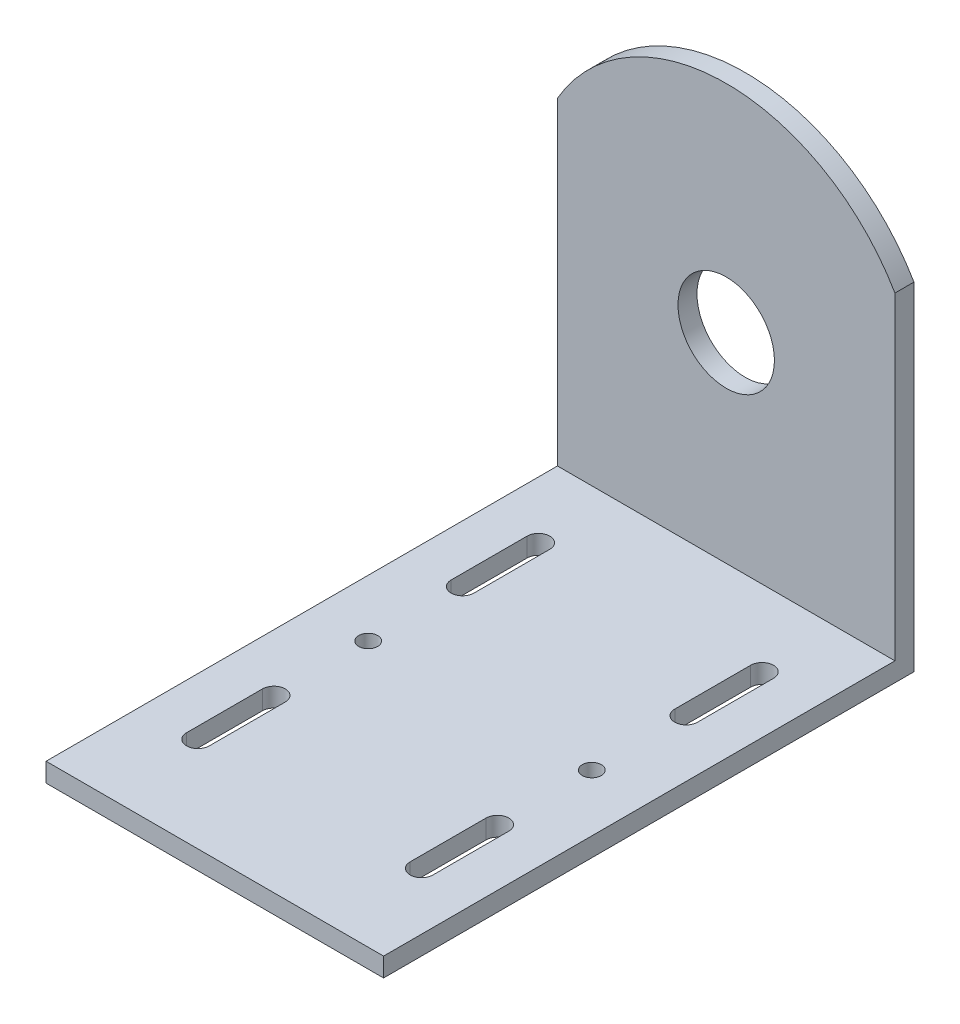
ISO-10303-21;
HEADER;
FILE_DESCRIPTION(('STEP AP214'),'2;1');
FILE_NAME('part.step','',(''),(''),'','','');
FILE_SCHEMA(('AUTOMOTIVE_DESIGN { 1 0 10303 214 1 1 1 1 }'));
ENDSEC;
DATA;
#1=APPLICATION_CONTEXT('core data for automotive mechanical design processes');
#2=APPLICATION_PROTOCOL_DEFINITION('international standard','automotive_design',2000,#1);
#3=PRODUCT_CONTEXT('',#1,'mechanical');
#4=PRODUCT('Part','Part','',(#3));
#5=PRODUCT_RELATED_PRODUCT_CATEGORY('part','',(#4));
#6=PRODUCT_DEFINITION_FORMATION('','',#4);
#7=PRODUCT_DEFINITION_CONTEXT('part definition',#1,'design');
#8=PRODUCT_DEFINITION('design','',#6,#7);
#9=PRODUCT_DEFINITION_SHAPE('','',#8);
#10=(LENGTH_UNIT() NAMED_UNIT(*) SI_UNIT(.MILLI.,.METRE.));
#11=(NAMED_UNIT(*) PLANE_ANGLE_UNIT() SI_UNIT($,.RADIAN.));
#12=(NAMED_UNIT(*) SI_UNIT($,.STERADIAN.) SOLID_ANGLE_UNIT());
#13=UNCERTAINTY_MEASURE_WITH_UNIT(LENGTH_MEASURE(1.E-05),#10,'distance_accuracy_value','');
#14=(GEOMETRIC_REPRESENTATION_CONTEXT(3) GLOBAL_UNCERTAINTY_ASSIGNED_CONTEXT((#13)) GLOBAL_UNIT_ASSIGNED_CONTEXT((#10,
#11,#12)) REPRESENTATION_CONTEXT('',''));
#15=CARTESIAN_POINT('',(0.,0.,0.));
#16=DIRECTION('',(0.,0.,1.));
#17=DIRECTION('',(1.,0.,0.));
#18=AXIS2_PLACEMENT_3D('',#15,#16,#17);
#19=CARTESIAN_POINT('',(0.,10.,0.));
#20=DIRECTION('',(0.,1.,0.));
#21=DIRECTION('',(0.,0.,1.));
#22=AXIS2_PLACEMENT_3D('',#19,#20,#21);
#23=PLANE('',#22);
#24=CARTESIAN_POINT('',(58.9,10.,139.7));
#25=DIRECTION('',(0.,-1.,0.));
#26=DIRECTION('',(0.,0.,-1.));
#27=AXIS2_PLACEMENT_3D('',#24,#25,#26);
#28=CIRCLE('',#27,5.);
#29=CARTESIAN_POINT('',(58.9,10.,134.7));
#30=VERTEX_POINT('',#29);
#31=EDGE_CURVE('E252',#30,#30,#28,.T.);
#32=ORIENTED_EDGE('',*,*,#31,.T.);
#33=EDGE_LOOP('',(#32));
#34=FACE_BOUND('',#33,.T.);
#35=CARTESIAN_POINT('',(-58.9,10.,189.4));
#36=DIRECTION('',(0.,1.,0.));
#37=DIRECTION('',(0.,0.,-1.));
#38=AXIS2_PLACEMENT_3D('',#35,#36,#37);
#39=CIRCLE('',#38,6.00000000000001);
#40=CARTESIAN_POINT('',(-52.9,10.,189.4));
#41=VERTEX_POINT('',#40);
#42=CARTESIAN_POINT('',(-64.9,10.,189.4));
#43=VERTEX_POINT('',#42);
#44=EDGE_CURVE('E87',#41,#43,#39,.T.);
#45=ORIENTED_EDGE('',*,*,#44,.F.);
#46=DIRECTION('',(0.,0.,-1.));
#47=VECTOR('',#46,1.);
#48=CARTESIAN_POINT('',(-52.9,10.,189.4));
#49=LINE('',#48,#47);
#50=CARTESIAN_POINT('',(-52.9,10.,229.4));
#51=VERTEX_POINT('',#50);
#52=EDGE_CURVE('E303',#51,#41,#49,.T.);
#53=ORIENTED_EDGE('',*,*,#52,.F.);
#54=CARTESIAN_POINT('',(-58.9,10.,229.4));
#55=DIRECTION('',(0.,1.,0.));
#56=DIRECTION('',(0.,0.,-1.));
#57=AXIS2_PLACEMENT_3D('',#54,#55,#56);
#58=CIRCLE('',#57,6.00000000000001);
#59=CARTESIAN_POINT('',(-64.9,10.,229.4));
#60=VERTEX_POINT('',#59);
#61=EDGE_CURVE('E317',#60,#51,#58,.T.);
#62=ORIENTED_EDGE('',*,*,#61,.F.);
#63=DIRECTION('',(0.,0.,1.));
#64=VECTOR('',#63,1.);
#65=CARTESIAN_POINT('',(-64.9,10.,189.4));
#66=LINE('',#65,#64);
#67=EDGE_CURVE('E314',#43,#60,#66,.T.);
#68=ORIENTED_EDGE('',*,*,#67,.F.);
#69=EDGE_LOOP('',(#45,#53,#62,#68));
#70=FACE_BOUND('',#69,.T.);
#71=CARTESIAN_POINT('',(58.9,10.,189.4));
#72=DIRECTION('',(0.,1.,0.));
#73=DIRECTION('',(0.,0.,1.));
#74=AXIS2_PLACEMENT_3D('',#71,#72,#73);
#75=CIRCLE('',#74,6.00000000000001);
#76=CARTESIAN_POINT('',(64.9,10.,189.4));
#77=VERTEX_POINT('',#76);
#78=CARTESIAN_POINT('',(52.9,10.,189.4));
#79=VERTEX_POINT('',#78);
#80=EDGE_CURVE('E95',#77,#79,#75,.T.);
#81=ORIENTED_EDGE('',*,*,#80,.F.);
#82=DIRECTION('',(0.,0.,-1.));
#83=VECTOR('',#82,1.);
#84=CARTESIAN_POINT('',(64.9,10.,189.4));
#85=LINE('',#84,#83);
#86=CARTESIAN_POINT('',(64.9,10.,229.4));
#87=VERTEX_POINT('',#86);
#88=EDGE_CURVE('E273',#87,#77,#85,.T.);
#89=ORIENTED_EDGE('',*,*,#88,.F.);
#90=CARTESIAN_POINT('',(58.9,10.,229.4));
#91=DIRECTION('',(0.,1.,0.));
#92=DIRECTION('',(0.,0.,1.));
#93=AXIS2_PLACEMENT_3D('',#90,#91,#92);
#94=CIRCLE('',#93,6.00000000000001);
#95=CARTESIAN_POINT('',(52.9,10.,229.4));
#96=VERTEX_POINT('',#95);
#97=EDGE_CURVE('E288',#96,#87,#94,.T.);
#98=ORIENTED_EDGE('',*,*,#97,.F.);
#99=DIRECTION('',(0.,0.,1.));
#100=VECTOR('',#99,1.);
#101=CARTESIAN_POINT('',(52.9,10.,189.4));
#102=LINE('',#101,#100);
#103=EDGE_CURVE('E284',#79,#96,#102,.T.);
#104=ORIENTED_EDGE('',*,*,#103,.F.);
#105=EDGE_LOOP('',(#81,#89,#98,#104));
#106=FACE_BOUND('',#105,.T.);
#107=CARTESIAN_POINT('',(58.9,10.,90.));
#108=DIRECTION('',(0.,1.,0.));
#109=DIRECTION('',(0.,0.,-1.));
#110=AXIS2_PLACEMENT_3D('',#107,#108,#109);
#111=CIRCLE('',#110,6.00000000000001);
#112=CARTESIAN_POINT('',(52.9,10.,90.));
#113=VERTEX_POINT('',#112);
#114=CARTESIAN_POINT('',(64.9,10.,90.));
#115=VERTEX_POINT('',#114);
#116=EDGE_CURVE('E228',#113,#115,#111,.T.);
#117=ORIENTED_EDGE('',*,*,#116,.F.);
#118=DIRECTION('',(0.,0.,1.));
#119=VECTOR('',#118,1.);
#120=CARTESIAN_POINT('',(52.9,10.,90.));
#121=LINE('',#120,#119);
#122=CARTESIAN_POINT('',(52.9,10.,50.));
#123=VERTEX_POINT('',#122);
#124=EDGE_CURVE('E246',#123,#113,#121,.T.);
#125=ORIENTED_EDGE('',*,*,#124,.F.);
#126=CARTESIAN_POINT('',(58.9,10.,50.));
#127=DIRECTION('',(0.,1.,0.));
#128=DIRECTION('',(0.,0.,-1.));
#129=AXIS2_PLACEMENT_3D('',#126,#127,#128);
#130=CIRCLE('',#129,6.00000000000001);
#131=CARTESIAN_POINT('',(64.9,10.,50.));
#132=VERTEX_POINT('',#131);
#133=EDGE_CURVE('E249',#132,#123,#130,.T.);
#134=ORIENTED_EDGE('',*,*,#133,.F.);
#135=DIRECTION('',(0.,0.,-1.));
#136=VECTOR('',#135,1.);
#137=CARTESIAN_POINT('',(64.9,10.,90.));
#138=LINE('',#137,#136);
#139=EDGE_CURVE('E258',#115,#132,#138,.T.);
#140=ORIENTED_EDGE('',*,*,#139,.F.);
#141=EDGE_LOOP('',(#117,#125,#134,#140));
#142=FACE_BOUND('',#141,.T.);
#143=CARTESIAN_POINT('',(-58.9,10.,90.));
#144=DIRECTION('',(0.,1.,0.));
#145=DIRECTION('',(0.,0.,1.));
#146=AXIS2_PLACEMENT_3D('',#143,#144,#145);
#147=CIRCLE('',#146,6.00000000000001);
#148=CARTESIAN_POINT('',(-64.9,10.,90.));
#149=VERTEX_POINT('',#148);
#150=CARTESIAN_POINT('',(-52.9,10.,90.));
#151=VERTEX_POINT('',#150);
#152=EDGE_CURVE('E265',#149,#151,#147,.T.);
#153=ORIENTED_EDGE('',*,*,#152,.F.);
#154=DIRECTION('',(0.,0.,1.));
#155=VECTOR('',#154,1.);
#156=CARTESIAN_POINT('',(-64.9,10.,90.));
#157=LINE('',#156,#155);
#158=CARTESIAN_POINT('',(-64.9,10.,50.));
#159=VERTEX_POINT('',#158);
#160=EDGE_CURVE('E332',#159,#149,#157,.T.);
#161=ORIENTED_EDGE('',*,*,#160,.F.);
#162=CARTESIAN_POINT('',(-58.9,10.,50.));
#163=DIRECTION('',(0.,1.,0.));
#164=DIRECTION('',(0.,0.,1.));
#165=AXIS2_PLACEMENT_3D('',#162,#163,#164);
#166=CIRCLE('',#165,6.00000000000001);
#167=CARTESIAN_POINT('',(-52.9,10.,50.));
#168=VERTEX_POINT('',#167);
#169=EDGE_CURVE('E346',#168,#159,#166,.T.);
#170=ORIENTED_EDGE('',*,*,#169,.F.);
#171=DIRECTION('',(0.,0.,-1.));
#172=VECTOR('',#171,1.);
#173=CARTESIAN_POINT('',(-52.9,10.,90.));
#174=LINE('',#173,#172);
#175=EDGE_CURVE('E343',#151,#168,#174,.T.);
#176=ORIENTED_EDGE('',*,*,#175,.F.);
#177=EDGE_LOOP('',(#153,#161,#170,#176));
#178=FACE_BOUND('',#177,.T.);
#179=DIRECTION('',(1.,0.,0.));
#180=VECTOR('',#179,1.);
#181=CARTESIAN_POINT('',(0.,10.,10.));
#182=LINE('',#181,#180);
#183=CARTESIAN_POINT('',(-88.9,10.,10.));
#184=VERTEX_POINT('',#183);
#185=CARTESIAN_POINT('',(88.9,10.,10.));
#186=VERTEX_POINT('',#185);
#187=EDGE_CURVE('E378',#184,#186,#182,.T.);
#188=ORIENTED_EDGE('',*,*,#187,.F.);
#189=DIRECTION('',(0.,0.,-1.));
#190=VECTOR('',#189,1.);
#191=CARTESIAN_POINT('',(-88.9,10.,0.));
#192=LINE('',#191,#190);
#193=CARTESIAN_POINT('',(-88.9,10.,279.4));
#194=VERTEX_POINT('',#193);
#195=EDGE_CURVE('E380',#194,#184,#192,.T.);
#196=ORIENTED_EDGE('',*,*,#195,.F.);
#197=DIRECTION('',(-1.,0.,0.));
#198=VECTOR('',#197,1.);
#199=CARTESIAN_POINT('',(-88.9,10.,279.4));
#200=LINE('',#199,#198);
#201=CARTESIAN_POINT('',(88.9,10.,279.4));
#202=VERTEX_POINT('',#201);
#203=EDGE_CURVE('E383',#202,#194,#200,.T.);
#204=ORIENTED_EDGE('',*,*,#203,.F.);
#205=DIRECTION('',(0.,0.,1.));
#206=VECTOR('',#205,1.);
#207=CARTESIAN_POINT('',(88.9,10.,0.));
#208=LINE('',#207,#206);
#209=EDGE_CURVE('E395',#186,#202,#208,.T.);
#210=ORIENTED_EDGE('',*,*,#209,.F.);
#211=EDGE_LOOP('',(#188,#196,#204,#210));
#212=FACE_BOUND('',#211,.T.);
#213=CARTESIAN_POINT('',(-58.9,10.,139.7));
#214=DIRECTION('',(0.,1.,0.));
#215=DIRECTION('',(0.,0.,1.));
#216=AXIS2_PLACEMENT_3D('',#213,#214,#215);
#217=CIRCLE('',#216,5.);
#218=CARTESIAN_POINT('',(-58.9,10.,144.7));
#219=VERTEX_POINT('',#218);
#220=EDGE_CURVE('E418',#219,#219,#217,.T.);
#221=ORIENTED_EDGE('',*,*,#220,.F.);
#222=EDGE_LOOP('',(#221));
#223=FACE_BOUND('',#222,.T.);
#224=ADVANCED_FACE('F71',(#34,#70,#106,#142,#178,#212,#223),#23,.T.);
#225=CARTESIAN_POINT('',(0.,0.,0.));
#226=DIRECTION('',(0.,1.,0.));
#227=DIRECTION('',(0.,0.,1.));
#228=AXIS2_PLACEMENT_3D('',#225,#226,#227);
#229=PLANE('',#228);
#230=DIRECTION('',(0.,0.,-1.));
#231=VECTOR('',#230,1.);
#232=CARTESIAN_POINT('',(-88.9,0.,0.));
#233=LINE('',#232,#231);
#234=CARTESIAN_POINT('',(-88.9,0.,279.4));
#235=VERTEX_POINT('',#234);
#236=CARTESIAN_POINT('',(-88.9,0.,0.));
#237=VERTEX_POINT('',#236);
#238=EDGE_CURVE('E384',#235,#237,#233,.T.);
#239=ORIENTED_EDGE('',*,*,#238,.T.);
#240=DIRECTION('',(1.,0.,0.));
#241=VECTOR('',#240,1.);
#242=CARTESIAN_POINT('',(-88.9,0.,0.));
#243=LINE('',#242,#241);
#244=CARTESIAN_POINT('',(88.9,0.,0.));
#245=VERTEX_POINT('',#244);
#246=EDGE_CURVE('E12',#237,#245,#243,.T.);
#247=ORIENTED_EDGE('',*,*,#246,.T.);
#248=DIRECTION('',(0.,0.,1.));
#249=VECTOR('',#248,1.);
#250=CARTESIAN_POINT('',(88.9,0.,0.));
#251=LINE('',#250,#249);
#252=CARTESIAN_POINT('',(88.9,0.,279.4));
#253=VERTEX_POINT('',#252);
#254=EDGE_CURVE('E79',#245,#253,#251,.T.);
#255=ORIENTED_EDGE('',*,*,#254,.T.);
#256=DIRECTION('',(-1.,0.,0.));
#257=VECTOR('',#256,1.);
#258=CARTESIAN_POINT('',(-88.9,0.,279.4));
#259=LINE('',#258,#257);
#260=EDGE_CURVE('E412',#253,#235,#259,.T.);
#261=ORIENTED_EDGE('',*,*,#260,.T.);
#262=EDGE_LOOP('',(#239,#247,#255,#261));
#263=FACE_BOUND('',#262,.T.);
#264=DIRECTION('',(0.,0.,1.));
#265=VECTOR('',#264,1.);
#266=CARTESIAN_POINT('',(-64.9,0.,90.));
#267=LINE('',#266,#265);
#268=CARTESIAN_POINT('',(-64.9,0.,50.));
#269=VERTEX_POINT('',#268);
#270=CARTESIAN_POINT('',(-64.9,0.,90.));
#271=VERTEX_POINT('',#270);
#272=EDGE_CURVE('E338',#269,#271,#267,.T.);
#273=ORIENTED_EDGE('',*,*,#272,.T.);
#274=CARTESIAN_POINT('',(-58.9,0.,90.));
#275=DIRECTION('',(0.,1.,0.));
#276=DIRECTION('',(0.,0.,1.));
#277=AXIS2_PLACEMENT_3D('',#274,#275,#276);
#278=CIRCLE('',#277,6.00000000000001);
#279=CARTESIAN_POINT('',(-52.9,0.,90.));
#280=VERTEX_POINT('',#279);
#281=EDGE_CURVE('E328',#271,#280,#278,.T.);
#282=ORIENTED_EDGE('',*,*,#281,.T.);
#283=DIRECTION('',(0.,0.,-1.));
#284=VECTOR('',#283,1.);
#285=CARTESIAN_POINT('',(-52.9,0.,90.));
#286=LINE('',#285,#284);
#287=CARTESIAN_POINT('',(-52.9,0.,50.));
#288=VERTEX_POINT('',#287);
#289=EDGE_CURVE('E331',#280,#288,#286,.T.);
#290=ORIENTED_EDGE('',*,*,#289,.T.);
#291=CARTESIAN_POINT('',(-58.9,0.,50.));
#292=DIRECTION('',(0.,1.,0.));
#293=DIRECTION('',(0.,0.,1.));
#294=AXIS2_PLACEMENT_3D('',#291,#292,#293);
#295=CIRCLE('',#294,6.00000000000001);
#296=EDGE_CURVE('E335',#288,#269,#295,.T.);
#297=ORIENTED_EDGE('',*,*,#296,.T.);
#298=EDGE_LOOP('',(#273,#282,#290,#297));
#299=FACE_BOUND('',#298,.T.);
#300=DIRECTION('',(0.,0.,1.));
#301=VECTOR('',#300,1.);
#302=CARTESIAN_POINT('',(52.9,0.,90.));
#303=LINE('',#302,#301);
#304=CARTESIAN_POINT('',(52.9,0.,50.));
#305=VERTEX_POINT('',#304);
#306=CARTESIAN_POINT('',(52.9,0.,90.));
#307=VERTEX_POINT('',#306);
#308=EDGE_CURVE('E233',#305,#307,#303,.T.);
#309=ORIENTED_EDGE('',*,*,#308,.T.);
#310=CARTESIAN_POINT('',(58.9,0.,90.));
#311=DIRECTION('',(0.,1.,0.));
#312=DIRECTION('',(0.,0.,-1.));
#313=AXIS2_PLACEMENT_3D('',#310,#311,#312);
#314=CIRCLE('',#313,6.00000000000001);
#315=CARTESIAN_POINT('',(64.9,0.,90.));
#316=VERTEX_POINT('',#315);
#317=EDGE_CURVE('E225',#307,#316,#314,.T.);
#318=ORIENTED_EDGE('',*,*,#317,.T.);
#319=DIRECTION('',(0.,0.,-1.));
#320=VECTOR('',#319,1.);
#321=CARTESIAN_POINT('',(64.9,0.,90.));
#322=LINE('',#321,#320);
#323=CARTESIAN_POINT('',(64.9,0.,50.));
#324=VERTEX_POINT('',#323);
#325=EDGE_CURVE('E237',#316,#324,#322,.T.);
#326=ORIENTED_EDGE('',*,*,#325,.T.);
#327=CARTESIAN_POINT('',(58.9,0.,50.));
#328=DIRECTION('',(0.,1.,0.));
#329=DIRECTION('',(0.,0.,-1.));
#330=AXIS2_PLACEMENT_3D('',#327,#328,#329);
#331=CIRCLE('',#330,6.00000000000001);
#332=EDGE_CURVE('E241',#324,#305,#331,.T.);
#333=ORIENTED_EDGE('',*,*,#332,.T.);
#334=EDGE_LOOP('',(#309,#318,#326,#333));
#335=FACE_BOUND('',#334,.T.);
#336=DIRECTION('',(0.,0.,-1.));
#337=VECTOR('',#336,1.);
#338=CARTESIAN_POINT('',(64.9,0.,189.4));
#339=LINE('',#338,#337);
#340=CARTESIAN_POINT('',(64.9,0.,229.4));
#341=VERTEX_POINT('',#340);
#342=CARTESIAN_POINT('',(64.9,0.,189.4));
#343=VERTEX_POINT('',#342);
#344=EDGE_CURVE('E279',#341,#343,#339,.T.);
#345=ORIENTED_EDGE('',*,*,#344,.T.);
#346=CARTESIAN_POINT('',(58.9,0.,189.4));
#347=DIRECTION('',(0.,1.,0.));
#348=DIRECTION('',(0.,0.,1.));
#349=AXIS2_PLACEMENT_3D('',#346,#347,#348);
#350=CIRCLE('',#349,6.00000000000001);
#351=CARTESIAN_POINT('',(52.9,0.,189.4));
#352=VERTEX_POINT('',#351);
#353=EDGE_CURVE('E269',#343,#352,#350,.T.);
#354=ORIENTED_EDGE('',*,*,#353,.T.);
#355=DIRECTION('',(0.,0.,1.));
#356=VECTOR('',#355,1.);
#357=CARTESIAN_POINT('',(52.9,0.,189.4));
#358=LINE('',#357,#356);
#359=CARTESIAN_POINT('',(52.9,0.,229.4));
#360=VERTEX_POINT('',#359);
#361=EDGE_CURVE('E272',#352,#360,#358,.T.);
#362=ORIENTED_EDGE('',*,*,#361,.T.);
#363=CARTESIAN_POINT('',(58.9,0.,229.4));
#364=DIRECTION('',(0.,1.,0.));
#365=DIRECTION('',(0.,0.,1.));
#366=AXIS2_PLACEMENT_3D('',#363,#364,#365);
#367=CIRCLE('',#366,6.00000000000001);
#368=EDGE_CURVE('E276',#360,#341,#367,.T.);
#369=ORIENTED_EDGE('',*,*,#368,.T.);
#370=EDGE_LOOP('',(#345,#354,#362,#369));
#371=FACE_BOUND('',#370,.T.);
#372=DIRECTION('',(0.,0.,-1.));
#373=VECTOR('',#372,1.);
#374=CARTESIAN_POINT('',(-52.9,0.,189.4));
#375=LINE('',#374,#373);
#376=CARTESIAN_POINT('',(-52.9,0.,229.4));
#377=VERTEX_POINT('',#376);
#378=CARTESIAN_POINT('',(-52.9,0.,189.4));
#379=VERTEX_POINT('',#378);
#380=EDGE_CURVE('E309',#377,#379,#375,.T.);
#381=ORIENTED_EDGE('',*,*,#380,.T.);
#382=CARTESIAN_POINT('',(-58.9,0.,189.4));
#383=DIRECTION('',(0.,1.,0.));
#384=DIRECTION('',(0.,0.,-1.));
#385=AXIS2_PLACEMENT_3D('',#382,#383,#384);
#386=CIRCLE('',#385,6.00000000000001);
#387=CARTESIAN_POINT('',(-64.9,0.,189.4));
#388=VERTEX_POINT('',#387);
#389=EDGE_CURVE('E299',#379,#388,#386,.T.);
#390=ORIENTED_EDGE('',*,*,#389,.T.);
#391=DIRECTION('',(0.,0.,1.));
#392=VECTOR('',#391,1.);
#393=CARTESIAN_POINT('',(-64.9,0.,189.4));
#394=LINE('',#393,#392);
#395=CARTESIAN_POINT('',(-64.9,0.,229.4));
#396=VERTEX_POINT('',#395);
#397=EDGE_CURVE('E302',#388,#396,#394,.T.);
#398=ORIENTED_EDGE('',*,*,#397,.T.);
#399=CARTESIAN_POINT('',(-58.9,0.,229.4));
#400=DIRECTION('',(0.,1.,0.));
#401=DIRECTION('',(0.,0.,-1.));
#402=AXIS2_PLACEMENT_3D('',#399,#400,#401);
#403=CIRCLE('',#402,6.00000000000001);
#404=EDGE_CURVE('E306',#396,#377,#403,.T.);
#405=ORIENTED_EDGE('',*,*,#404,.T.);
#406=EDGE_LOOP('',(#381,#390,#398,#405));
#407=FACE_BOUND('',#406,.T.);
#408=CARTESIAN_POINT('',(58.9,0.,139.7));
#409=DIRECTION('',(0.,1.,0.));
#410=DIRECTION('',(0.,0.,1.));
#411=AXIS2_PLACEMENT_3D('',#408,#409,#410);
#412=CIRCLE('',#411,5.);
#413=CARTESIAN_POINT('',(58.9,0.,144.7));
#414=VERTEX_POINT('',#413);
#415=EDGE_CURVE('E416',#414,#414,#412,.F.);
#416=ORIENTED_EDGE('',*,*,#415,.F.);
#417=EDGE_LOOP('',(#416));
#418=FACE_BOUND('',#417,.T.);
#419=CARTESIAN_POINT('',(-58.9,0.,139.7));
#420=DIRECTION('',(0.,1.,0.));
#421=DIRECTION('',(0.,0.,1.));
#422=AXIS2_PLACEMENT_3D('',#419,#420,#421);
#423=CIRCLE('',#422,5.);
#424=CARTESIAN_POINT('',(-58.9,0.,144.7));
#425=VERTEX_POINT('',#424);
#426=EDGE_CURVE('E74',#425,#425,#423,.T.);
#427=ORIENTED_EDGE('',*,*,#426,.T.);
#428=EDGE_LOOP('',(#427));
#429=FACE_BOUND('',#428,.T.);
#430=ADVANCED_FACE('F243',(#263,#299,#335,#371,#407,#418,#429),#229,.F.);
#431=CARTESIAN_POINT('',(-88.9,0.,0.));
#432=DIRECTION('',(1.,0.,0.));
#433=DIRECTION('',(0.,0.,-1.));
#434=AXIS2_PLACEMENT_3D('',#431,#432,#433);
#435=PLANE('',#434);
#436=ORIENTED_EDGE('',*,*,#195,.T.);
#437=DIRECTION('',(0.,-1.,0.));
#438=VECTOR('',#437,1.);
#439=CARTESIAN_POINT('',(-88.9,177.796999188186,10.));
#440=LINE('',#439,#438);
#441=CARTESIAN_POINT('',(-88.9,177.796999188186,10.));
#442=VERTEX_POINT('',#441);
#443=EDGE_CURVE('E368',#442,#184,#440,.T.);
#444=ORIENTED_EDGE('',*,*,#443,.F.);
#445=DIRECTION('',(0.,0.,-1.));
#446=VECTOR('',#445,1.);
#447=CARTESIAN_POINT('',(-88.9,177.796999188186,10.));
#448=LINE('',#447,#446);
#449=CARTESIAN_POINT('',(-88.9,177.796999188186,0.));
#450=VERTEX_POINT('',#449);
#451=EDGE_CURVE('E370',#442,#450,#448,.T.);
#452=ORIENTED_EDGE('',*,*,#451,.T.);
#453=DIRECTION('',(0.,1.,0.));
#454=VECTOR('',#453,1.);
#455=CARTESIAN_POINT('',(-88.9,0.,0.));
#456=LINE('',#455,#454);
#457=EDGE_CURVE('E381',#237,#450,#456,.T.);
#458=ORIENTED_EDGE('',*,*,#457,.F.);
#459=ORIENTED_EDGE('',*,*,#238,.F.);
#460=DIRECTION('',(0.,1.,0.));
#461=VECTOR('',#460,1.);
#462=CARTESIAN_POINT('',(-88.9,0.,279.4));
#463=LINE('',#462,#461);
#464=EDGE_CURVE('E388',#235,#194,#463,.T.);
#465=ORIENTED_EDGE('',*,*,#464,.T.);
#466=EDGE_LOOP('',(#436,#444,#452,#458,#459,#465));
#467=FACE_BOUND('',#466,.T.);
#468=ADVANCED_FACE('F448',(#467),#435,.F.);
#469=CARTESIAN_POINT('',(-88.9,0.,279.4));
#470=DIRECTION('',(0.,0.,-1.));
#471=DIRECTION('',(-1.,0.,0.));
#472=AXIS2_PLACEMENT_3D('',#469,#470,#471);
#473=PLANE('',#472);
#474=ORIENTED_EDGE('',*,*,#203,.T.);
#475=ORIENTED_EDGE('',*,*,#464,.F.);
#476=ORIENTED_EDGE('',*,*,#260,.F.);
#477=DIRECTION('',(0.,1.,0.));
#478=VECTOR('',#477,1.);
#479=CARTESIAN_POINT('',(88.9,0.,279.4));
#480=LINE('',#479,#478);
#481=EDGE_CURVE('E407',#253,#202,#480,.T.);
#482=ORIENTED_EDGE('',*,*,#481,.T.);
#483=EDGE_LOOP('',(#474,#475,#476,#482));
#484=FACE_BOUND('',#483,.T.);
#485=ADVANCED_FACE('F454',(#484),#473,.F.);
#486=CARTESIAN_POINT('',(88.9,0.,0.));
#487=DIRECTION('',(-1.,0.,0.));
#488=DIRECTION('',(0.,0.,1.));
#489=AXIS2_PLACEMENT_3D('',#486,#487,#488);
#490=PLANE('',#489);
#491=ORIENTED_EDGE('',*,*,#481,.F.);
#492=ORIENTED_EDGE('',*,*,#254,.F.);
#493=DIRECTION('',(0.,1.,0.));
#494=VECTOR('',#493,1.);
#495=CARTESIAN_POINT('',(88.9,0.,0.));
#496=LINE('',#495,#494);
#497=CARTESIAN_POINT('',(88.9,177.796999188186,0.));
#498=VERTEX_POINT('',#497);
#499=EDGE_CURVE('E393',#245,#498,#496,.T.);
#500=ORIENTED_EDGE('',*,*,#499,.T.);
#501=DIRECTION('',(0.,0.,-1.));
#502=VECTOR('',#501,1.);
#503=CARTESIAN_POINT('',(88.9,177.796999188186,10.));
#504=LINE('',#503,#502);
#505=CARTESIAN_POINT('',(88.9,177.796999188186,10.));
#506=VERTEX_POINT('',#505);
#507=EDGE_CURVE('E375',#506,#498,#504,.T.);
#508=ORIENTED_EDGE('',*,*,#507,.F.);
#509=DIRECTION('',(0.,1.,0.));
#510=VECTOR('',#509,1.);
#511=CARTESIAN_POINT('',(88.9,177.796999188186,10.));
#512=LINE('',#511,#510);
#513=EDGE_CURVE('E363',#186,#506,#512,.T.);
#514=ORIENTED_EDGE('',*,*,#513,.F.);
#515=ORIENTED_EDGE('',*,*,#209,.T.);
#516=EDGE_LOOP('',(#491,#492,#500,#508,#514,#515));
#517=FACE_BOUND('',#516,.T.);
#518=ADVANCED_FACE('F461',(#517),#490,.F.);
#519=CARTESIAN_POINT('',(-88.9,0.,0.));
#520=DIRECTION('',(0.,0.,1.));
#521=DIRECTION('',(1.,0.,0.));
#522=AXIS2_PLACEMENT_3D('',#519,#520,#521);
#523=PLANE('',#522);
#524=CARTESIAN_POINT('',(0.,115.3,0.));
#525=DIRECTION('',(0.,0.,-1.));
#526=DIRECTION('',(-1.,0.,0.));
#527=AXIS2_PLACEMENT_3D('',#524,#525,#526);
#528=CIRCLE('',#527,25.4);
#529=CARTESIAN_POINT('',(-25.4,115.3,0.));
#530=VERTEX_POINT('',#529);
#531=EDGE_CURVE('E353',#530,#530,#528,.T.);
#532=ORIENTED_EDGE('',*,*,#531,.F.);
#533=EDGE_LOOP('',(#532));
#534=FACE_BOUND('',#533,.T.);
#535=ORIENTED_EDGE('',*,*,#457,.T.);
#536=CARTESIAN_POINT('',(0.,126.238,0.));
#537=DIRECTION('',(0.,0.,1.));
#538=DIRECTION('',(1.,0.,0.));
#539=AXIS2_PLACEMENT_3D('',#536,#537,#538);
#540=CIRCLE('',#539,102.769355341402);
#541=EDGE_CURVE('E366',#498,#450,#540,.T.);
#542=ORIENTED_EDGE('',*,*,#541,.F.);
#543=ORIENTED_EDGE('',*,*,#499,.F.);
#544=ORIENTED_EDGE('',*,*,#246,.F.);
#545=EDGE_LOOP('',(#535,#542,#543,#544));
#546=FACE_BOUND('',#545,.T.);
#547=ADVANCED_FACE('F450',(#534,#546),#523,.F.);
#548=CARTESIAN_POINT('',(0.,126.238,10.));
#549=DIRECTION('',(0.,0.,-1.));
#550=DIRECTION('',(-1.,0.,0.));
#551=AXIS2_PLACEMENT_3D('',#548,#549,#550);
#552=CYLINDRICAL_SURFACE('',#551,102.769355341402);
#553=ORIENTED_EDGE('',*,*,#541,.T.);
#554=ORIENTED_EDGE('',*,*,#451,.F.);
#555=CARTESIAN_POINT('',(0.,126.238,10.));
#556=DIRECTION('',(0.,0.,1.));
#557=DIRECTION('',(1.,0.,0.));
#558=AXIS2_PLACEMENT_3D('',#555,#556,#557);
#559=CIRCLE('',#558,102.769355341402);
#560=EDGE_CURVE('E365',#506,#442,#559,.T.);
#561=ORIENTED_EDGE('',*,*,#560,.F.);
#562=ORIENTED_EDGE('',*,*,#507,.T.);
#563=EDGE_LOOP('',(#553,#554,#561,#562));
#564=FACE_BOUND('',#563,.T.);
#565=ADVANCED_FACE('F457',(#564),#552,.T.);
#566=CARTESIAN_POINT('',(0.,126.238,10.));
#567=DIRECTION('',(0.,0.,1.));
#568=DIRECTION('',(1.,0.,0.));
#569=AXIS2_PLACEMENT_3D('',#566,#567,#568);
#570=PLANE('',#569);
#571=CARTESIAN_POINT('',(0.,115.3,10.));
#572=DIRECTION('',(0.,0.,1.));
#573=DIRECTION('',(1.,0.,0.));
#574=AXIS2_PLACEMENT_3D('',#571,#572,#573);
#575=CIRCLE('',#574,25.4);
#576=CARTESIAN_POINT('',(25.4,115.3,10.));
#577=VERTEX_POINT('',#576);
#578=EDGE_CURVE('E362',#577,#577,#575,.T.);
#579=ORIENTED_EDGE('',*,*,#578,.F.);
#580=EDGE_LOOP('',(#579));
#581=FACE_BOUND('',#580,.T.);
#582=ORIENTED_EDGE('',*,*,#443,.T.);
#583=ORIENTED_EDGE('',*,*,#187,.T.);
#584=ORIENTED_EDGE('',*,*,#513,.T.);
#585=ORIENTED_EDGE('',*,*,#560,.T.);
#586=EDGE_LOOP('',(#582,#583,#584,#585));
#587=FACE_BOUND('',#586,.T.);
#588=ADVANCED_FACE('F467',(#581,#587),#570,.T.);
#589=CARTESIAN_POINT('',(0.,115.3,279.400103077641));
#590=DIRECTION('',(0.,0.,-1.));
#591=DIRECTION('',(-1.,0.,0.));
#592=AXIS2_PLACEMENT_3D('',#589,#590,#591);
#593=CYLINDRICAL_SURFACE('',#592,25.4);
#594=ORIENTED_EDGE('',*,*,#578,.T.);
#595=EDGE_LOOP('',(#594));
#596=FACE_BOUND('',#595,.T.);
#597=ORIENTED_EDGE('',*,*,#531,.T.);
#598=EDGE_LOOP('',(#597));
#599=FACE_BOUND('',#598,.T.);
#600=ADVANCED_FACE('F480',(#596,#599),#593,.F.);
#601=CARTESIAN_POINT('',(-58.9,0.,90.));
#602=DIRECTION('',(0.,1.,0.));
#603=DIRECTION('',(0.,0.,1.));
#604=AXIS2_PLACEMENT_3D('',#601,#602,#603);
#605=CYLINDRICAL_SURFACE('',#604,6.00000000000001);
#606=ORIENTED_EDGE('',*,*,#152,.T.);
#607=DIRECTION('',(0.,1.,0.));
#608=VECTOR('',#607,1.);
#609=CARTESIAN_POINT('',(-52.9,0.,90.));
#610=LINE('',#609,#608);
#611=EDGE_CURVE('E341',#280,#151,#610,.T.);
#612=ORIENTED_EDGE('',*,*,#611,.F.);
#613=ORIENTED_EDGE('',*,*,#281,.F.);
#614=DIRECTION('',(0.,1.,0.));
#615=VECTOR('',#614,1.);
#616=CARTESIAN_POINT('',(-64.9,0.,90.));
#617=LINE('',#616,#615);
#618=EDGE_CURVE('E351',#271,#149,#617,.T.);
#619=ORIENTED_EDGE('',*,*,#618,.T.);
#620=EDGE_LOOP('',(#606,#612,#613,#619));
#621=FACE_BOUND('',#620,.T.);
#622=ADVANCED_FACE('F484',(#621),#605,.F.);
#623=CARTESIAN_POINT('',(-64.9,0.,90.));
#624=DIRECTION('',(-1.,0.,0.));
#625=DIRECTION('',(0.,0.,1.));
#626=AXIS2_PLACEMENT_3D('',#623,#624,#625);
#627=PLANE('',#626);
#628=ORIENTED_EDGE('',*,*,#160,.T.);
#629=ORIENTED_EDGE('',*,*,#618,.F.);
#630=ORIENTED_EDGE('',*,*,#272,.F.);
#631=DIRECTION('',(0.,1.,0.));
#632=VECTOR('',#631,1.);
#633=CARTESIAN_POINT('',(-64.9,0.,50.));
#634=LINE('',#633,#632);
#635=EDGE_CURVE('E354',#269,#159,#634,.T.);
#636=ORIENTED_EDGE('',*,*,#635,.T.);
#637=EDGE_LOOP('',(#628,#629,#630,#636));
#638=FACE_BOUND('',#637,.T.);
#639=ADVANCED_FACE('F488',(#638),#627,.F.);
#640=CARTESIAN_POINT('',(-58.9,0.,50.));
#641=DIRECTION('',(0.,1.,0.));
#642=DIRECTION('',(0.,0.,1.));
#643=AXIS2_PLACEMENT_3D('',#640,#641,#642);
#644=CYLINDRICAL_SURFACE('',#643,6.00000000000001);
#645=ORIENTED_EDGE('',*,*,#169,.T.);
#646=ORIENTED_EDGE('',*,*,#635,.F.);
#647=ORIENTED_EDGE('',*,*,#296,.F.);
#648=DIRECTION('',(0.,1.,0.));
#649=VECTOR('',#648,1.);
#650=CARTESIAN_POINT('',(-52.9,0.,50.));
#651=LINE('',#650,#649);
#652=EDGE_CURVE('E356',#288,#168,#651,.T.);
#653=ORIENTED_EDGE('',*,*,#652,.T.);
#654=EDGE_LOOP('',(#645,#646,#647,#653));
#655=FACE_BOUND('',#654,.T.);
#656=ADVANCED_FACE('F493',(#655),#644,.F.);
#657=CARTESIAN_POINT('',(-52.9,0.,90.));
#658=DIRECTION('',(1.,0.,0.));
#659=DIRECTION('',(0.,0.,-1.));
#660=AXIS2_PLACEMENT_3D('',#657,#658,#659);
#661=PLANE('',#660);
#662=ORIENTED_EDGE('',*,*,#175,.T.);
#663=ORIENTED_EDGE('',*,*,#652,.F.);
#664=ORIENTED_EDGE('',*,*,#289,.F.);
#665=ORIENTED_EDGE('',*,*,#611,.T.);
#666=EDGE_LOOP('',(#662,#663,#664,#665));
#667=FACE_BOUND('',#666,.T.);
#668=ADVANCED_FACE('F490',(#667),#661,.F.);
#669=CARTESIAN_POINT('',(58.9,0.,90.));
#670=DIRECTION('',(0.,1.,0.));
#671=DIRECTION('',(0.,0.,1.));
#672=AXIS2_PLACEMENT_3D('',#669,#670,#671);
#673=CYLINDRICAL_SURFACE('',#672,6.00000000000001);
#674=ORIENTED_EDGE('',*,*,#116,.T.);
#675=DIRECTION('',(0.,1.,0.));
#676=VECTOR('',#675,1.);
#677=CARTESIAN_POINT('',(64.9,0.,90.));
#678=LINE('',#677,#676);
#679=EDGE_CURVE('E221',#316,#115,#678,.T.);
#680=ORIENTED_EDGE('',*,*,#679,.F.);
#681=ORIENTED_EDGE('',*,*,#317,.F.);
#682=DIRECTION('',(0.,1.,0.));
#683=VECTOR('',#682,1.);
#684=CARTESIAN_POINT('',(52.9,0.,90.));
#685=LINE('',#684,#683);
#686=EDGE_CURVE('E263',#307,#113,#685,.T.);
#687=ORIENTED_EDGE('',*,*,#686,.T.);
#688=EDGE_LOOP('',(#674,#680,#681,#687));
#689=FACE_BOUND('',#688,.T.);
#690=ADVANCED_FACE('F223',(#689),#673,.F.);
#691=CARTESIAN_POINT('',(52.9,0.,90.));
#692=DIRECTION('',(-1.,0.,0.));
#693=DIRECTION('',(0.,0.,1.));
#694=AXIS2_PLACEMENT_3D('',#691,#692,#693);
#695=PLANE('',#694);
#696=ORIENTED_EDGE('',*,*,#124,.T.);
#697=ORIENTED_EDGE('',*,*,#686,.F.);
#698=ORIENTED_EDGE('',*,*,#308,.F.);
#699=DIRECTION('',(0.,1.,0.));
#700=VECTOR('',#699,1.);
#701=CARTESIAN_POINT('',(52.9,0.,50.));
#702=LINE('',#701,#700);
#703=EDGE_CURVE('E266',#305,#123,#702,.T.);
#704=ORIENTED_EDGE('',*,*,#703,.T.);
#705=EDGE_LOOP('',(#696,#697,#698,#704));
#706=FACE_BOUND('',#705,.T.);
#707=ADVANCED_FACE('F528',(#706),#695,.F.);
#708=CARTESIAN_POINT('',(58.9,0.,50.));
#709=DIRECTION('',(0.,1.,0.));
#710=DIRECTION('',(0.,0.,1.));
#711=AXIS2_PLACEMENT_3D('',#708,#709,#710);
#712=CYLINDRICAL_SURFACE('',#711,6.00000000000001);
#713=ORIENTED_EDGE('',*,*,#133,.T.);
#714=ORIENTED_EDGE('',*,*,#703,.F.);
#715=ORIENTED_EDGE('',*,*,#332,.F.);
#716=DIRECTION('',(0.,1.,0.));
#717=VECTOR('',#716,1.);
#718=CARTESIAN_POINT('',(64.9,0.,50.));
#719=LINE('',#718,#717);
#720=EDGE_CURVE('E232',#324,#132,#719,.T.);
#721=ORIENTED_EDGE('',*,*,#720,.T.);
#722=EDGE_LOOP('',(#713,#714,#715,#721));
#723=FACE_BOUND('',#722,.T.);
#724=ADVANCED_FACE('F531',(#723),#712,.F.);
#725=CARTESIAN_POINT('',(64.9,0.,90.));
#726=DIRECTION('',(1.,0.,0.));
#727=DIRECTION('',(0.,0.,-1.));
#728=AXIS2_PLACEMENT_3D('',#725,#726,#727);
#729=PLANE('',#728);
#730=ORIENTED_EDGE('',*,*,#139,.T.);
#731=ORIENTED_EDGE('',*,*,#720,.F.);
#732=ORIENTED_EDGE('',*,*,#325,.F.);
#733=ORIENTED_EDGE('',*,*,#679,.T.);
#734=EDGE_LOOP('',(#730,#731,#732,#733));
#735=FACE_BOUND('',#734,.T.);
#736=ADVANCED_FACE('F238',(#735),#729,.F.);
#737=CARTESIAN_POINT('',(58.9,0.,189.4));
#738=DIRECTION('',(0.,1.,0.));
#739=DIRECTION('',(0.,0.,1.));
#740=AXIS2_PLACEMENT_3D('',#737,#738,#739);
#741=CYLINDRICAL_SURFACE('',#740,6.00000000000001);
#742=ORIENTED_EDGE('',*,*,#80,.T.);
#743=DIRECTION('',(0.,1.,0.));
#744=VECTOR('',#743,1.);
#745=CARTESIAN_POINT('',(52.9,0.,189.4));
#746=LINE('',#745,#744);
#747=EDGE_CURVE('E282',#352,#79,#746,.T.);
#748=ORIENTED_EDGE('',*,*,#747,.F.);
#749=ORIENTED_EDGE('',*,*,#353,.F.);
#750=DIRECTION('',(0.,1.,0.));
#751=VECTOR('',#750,1.);
#752=CARTESIAN_POINT('',(64.9,0.,189.4));
#753=LINE('',#752,#751);
#754=EDGE_CURVE('E259',#343,#77,#753,.T.);
#755=ORIENTED_EDGE('',*,*,#754,.T.);
#756=EDGE_LOOP('',(#742,#748,#749,#755));
#757=FACE_BOUND('',#756,.T.);
#758=ADVANCED_FACE('F512',(#757),#741,.F.);
#759=CARTESIAN_POINT('',(64.9,0.,189.4));
#760=DIRECTION('',(1.,0.,0.));
#761=DIRECTION('',(0.,0.,-1.));
#762=AXIS2_PLACEMENT_3D('',#759,#760,#761);
#763=PLANE('',#762);
#764=ORIENTED_EDGE('',*,*,#88,.T.);
#765=ORIENTED_EDGE('',*,*,#754,.F.);
#766=ORIENTED_EDGE('',*,*,#344,.F.);
#767=DIRECTION('',(0.,1.,0.));
#768=VECTOR('',#767,1.);
#769=CARTESIAN_POINT('',(64.9,0.,229.4));
#770=LINE('',#769,#768);
#771=EDGE_CURVE('E294',#341,#87,#770,.T.);
#772=ORIENTED_EDGE('',*,*,#771,.T.);
#773=EDGE_LOOP('',(#764,#765,#766,#772));
#774=FACE_BOUND('',#773,.T.);
#775=ADVANCED_FACE('F515',(#774),#763,.F.);
#776=CARTESIAN_POINT('',(58.9,0.,229.4));
#777=DIRECTION('',(0.,1.,0.));
#778=DIRECTION('',(0.,0.,1.));
#779=AXIS2_PLACEMENT_3D('',#776,#777,#778);
#780=CYLINDRICAL_SURFACE('',#779,6.00000000000001);
#781=ORIENTED_EDGE('',*,*,#97,.T.);
#782=ORIENTED_EDGE('',*,*,#771,.F.);
#783=ORIENTED_EDGE('',*,*,#368,.F.);
#784=DIRECTION('',(0.,1.,0.));
#785=VECTOR('',#784,1.);
#786=CARTESIAN_POINT('',(52.9,0.,229.4));
#787=LINE('',#786,#785);
#788=EDGE_CURVE('E296',#360,#96,#787,.T.);
#789=ORIENTED_EDGE('',*,*,#788,.T.);
#790=EDGE_LOOP('',(#781,#782,#783,#789));
#791=FACE_BOUND('',#790,.T.);
#792=ADVANCED_FACE('F518',(#791),#780,.F.);
#793=CARTESIAN_POINT('',(52.9,0.,189.4));
#794=DIRECTION('',(-1.,0.,0.));
#795=DIRECTION('',(0.,0.,1.));
#796=AXIS2_PLACEMENT_3D('',#793,#794,#795);
#797=PLANE('',#796);
#798=ORIENTED_EDGE('',*,*,#103,.T.);
#799=ORIENTED_EDGE('',*,*,#788,.F.);
#800=ORIENTED_EDGE('',*,*,#361,.F.);
#801=ORIENTED_EDGE('',*,*,#747,.T.);
#802=EDGE_LOOP('',(#798,#799,#800,#801));
#803=FACE_BOUND('',#802,.T.);
#804=ADVANCED_FACE('F504',(#803),#797,.F.);
#805=CARTESIAN_POINT('',(-58.9,0.,189.4));
#806=DIRECTION('',(0.,1.,0.));
#807=DIRECTION('',(0.,0.,1.));
#808=AXIS2_PLACEMENT_3D('',#805,#806,#807);
#809=CYLINDRICAL_SURFACE('',#808,6.00000000000001);
#810=ORIENTED_EDGE('',*,*,#44,.T.);
#811=DIRECTION('',(0.,1.,0.));
#812=VECTOR('',#811,1.);
#813=CARTESIAN_POINT('',(-64.9,0.,189.4));
#814=LINE('',#813,#812);
#815=EDGE_CURVE('E312',#388,#43,#814,.T.);
#816=ORIENTED_EDGE('',*,*,#815,.F.);
#817=ORIENTED_EDGE('',*,*,#389,.F.);
#818=DIRECTION('',(0.,1.,0.));
#819=VECTOR('',#818,1.);
#820=CARTESIAN_POINT('',(-52.9,0.,189.4));
#821=LINE('',#820,#819);
#822=EDGE_CURVE('E285',#379,#41,#821,.T.);
#823=ORIENTED_EDGE('',*,*,#822,.T.);
#824=EDGE_LOOP('',(#810,#816,#817,#823));
#825=FACE_BOUND('',#824,.T.);
#826=ADVANCED_FACE('F501',(#825),#809,.F.);
#827=CARTESIAN_POINT('',(-52.9,0.,189.4));
#828=DIRECTION('',(1.,0.,0.));
#829=DIRECTION('',(0.,0.,-1.));
#830=AXIS2_PLACEMENT_3D('',#827,#828,#829);
#831=PLANE('',#830);
#832=ORIENTED_EDGE('',*,*,#52,.T.);
#833=ORIENTED_EDGE('',*,*,#822,.F.);
#834=ORIENTED_EDGE('',*,*,#380,.F.);
#835=DIRECTION('',(0.,1.,0.));
#836=VECTOR('',#835,1.);
#837=CARTESIAN_POINT('',(-52.9,0.,229.4));
#838=LINE('',#837,#836);
#839=EDGE_CURVE('E323',#377,#51,#838,.T.);
#840=ORIENTED_EDGE('',*,*,#839,.T.);
#841=EDGE_LOOP('',(#832,#833,#834,#840));
#842=FACE_BOUND('',#841,.T.);
#843=ADVANCED_FACE('F503',(#842),#831,.F.);
#844=CARTESIAN_POINT('',(-58.9,0.,229.4));
#845=DIRECTION('',(0.,1.,0.));
#846=DIRECTION('',(0.,0.,1.));
#847=AXIS2_PLACEMENT_3D('',#844,#845,#846);
#848=CYLINDRICAL_SURFACE('',#847,6.00000000000001);
#849=ORIENTED_EDGE('',*,*,#61,.T.);
#850=ORIENTED_EDGE('',*,*,#839,.F.);
#851=ORIENTED_EDGE('',*,*,#404,.F.);
#852=DIRECTION('',(0.,1.,0.));
#853=VECTOR('',#852,1.);
#854=CARTESIAN_POINT('',(-64.9,0.,229.4));
#855=LINE('',#854,#853);
#856=EDGE_CURVE('E325',#396,#60,#855,.T.);
#857=ORIENTED_EDGE('',*,*,#856,.T.);
#858=EDGE_LOOP('',(#849,#850,#851,#857));
#859=FACE_BOUND('',#858,.T.);
#860=ADVANCED_FACE('F440',(#859),#848,.F.);
#861=CARTESIAN_POINT('',(-64.9,0.,189.4));
#862=DIRECTION('',(-1.,0.,0.));
#863=DIRECTION('',(0.,0.,1.));
#864=AXIS2_PLACEMENT_3D('',#861,#862,#863);
#865=PLANE('',#864);
#866=ORIENTED_EDGE('',*,*,#67,.T.);
#867=ORIENTED_EDGE('',*,*,#856,.F.);
#868=ORIENTED_EDGE('',*,*,#397,.F.);
#869=ORIENTED_EDGE('',*,*,#815,.T.);
#870=EDGE_LOOP('',(#866,#867,#868,#869));
#871=FACE_BOUND('',#870,.T.);
#872=ADVANCED_FACE('F433',(#871),#865,.F.);
#873=CARTESIAN_POINT('',(58.9,-0.000103077640640006,139.7));
#874=DIRECTION('',(0.,1.,0.));
#875=DIRECTION('',(0.,0.,1.));
#876=AXIS2_PLACEMENT_3D('',#873,#874,#875);
#877=CYLINDRICAL_SURFACE('',#876,5.);
#878=ORIENTED_EDGE('',*,*,#31,.F.);
#879=EDGE_LOOP('',(#878));
#880=FACE_BOUND('',#879,.T.);
#881=ORIENTED_EDGE('',*,*,#415,.T.);
#882=EDGE_LOOP('',(#881));
#883=FACE_BOUND('',#882,.T.);
#884=ADVANCED_FACE('F430',(#880,#883),#877,.F.);
#885=CARTESIAN_POINT('',(-58.9,-0.000103077640640006,139.7));
#886=DIRECTION('',(0.,1.,0.));
#887=DIRECTION('',(0.,0.,1.));
#888=AXIS2_PLACEMENT_3D('',#885,#886,#887);
#889=CYLINDRICAL_SURFACE('',#888,5.);
#890=ORIENTED_EDGE('',*,*,#220,.T.);
#891=EDGE_LOOP('',(#890));
#892=FACE_BOUND('',#891,.T.);
#893=ORIENTED_EDGE('',*,*,#426,.F.);
#894=EDGE_LOOP('',(#893));
#895=FACE_BOUND('',#894,.T.);
#896=ADVANCED_FACE('F432',(#892,#895),#889,.F.);
#897=CLOSED_SHELL('',(#224,#430,#468,#485,#518,#547,#565,#588,#600,#622,#639,#656,#668,#690,
#707,#724,#736,#758,#775,#792,#804,#826,#843,#860,#872,#884,#896));
#898=MANIFOLD_SOLID_BREP('B2',#897);
#899=ADVANCED_BREP_SHAPE_REPRESENTATION('',(#18,#898),#14);
#900=SHAPE_DEFINITION_REPRESENTATION(#9,#899);
ENDSEC;
END-ISO-10303-21;
